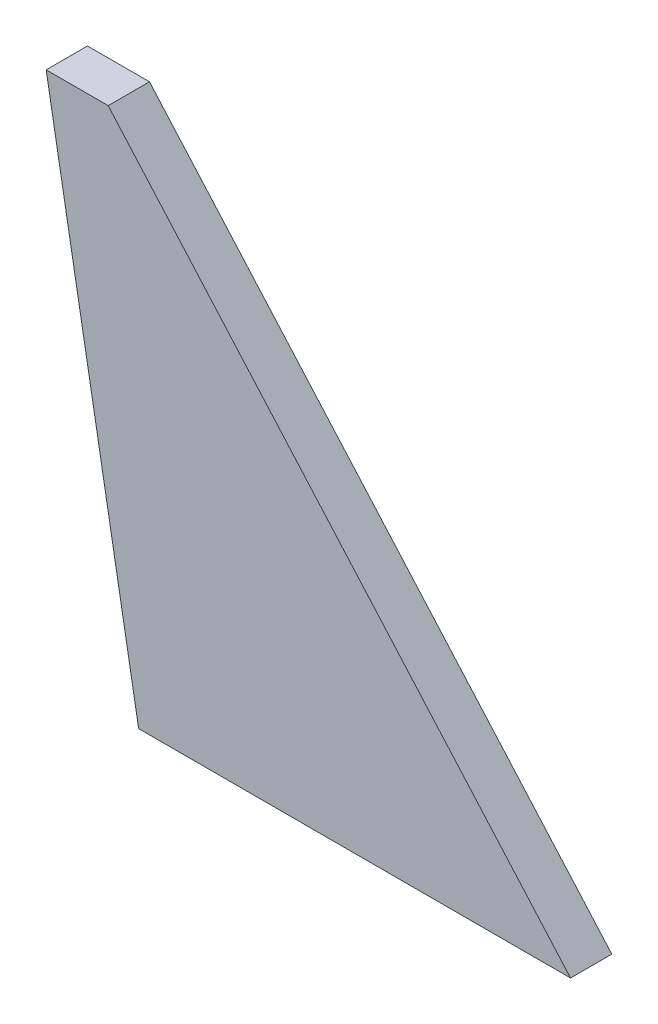
ISO-10303-21;
HEADER;
FILE_DESCRIPTION(('STEP AP214'),'2;1');
FILE_NAME('part.step','',(''),(''),'','','');
FILE_SCHEMA(('AUTOMOTIVE_DESIGN { 1 0 10303 214 1 1 1 1 }'));
ENDSEC;
DATA;
#1=APPLICATION_CONTEXT('core data for automotive mechanical design processes');
#2=APPLICATION_PROTOCOL_DEFINITION('international standard','automotive_design',2000,#1);
#3=PRODUCT_CONTEXT('',#1,'mechanical');
#4=PRODUCT('Part','Part','',(#3));
#5=PRODUCT_RELATED_PRODUCT_CATEGORY('part','',(#4));
#6=PRODUCT_DEFINITION_FORMATION('','',#4);
#7=PRODUCT_DEFINITION_CONTEXT('part definition',#1,'design');
#8=PRODUCT_DEFINITION('design','',#6,#7);
#9=PRODUCT_DEFINITION_SHAPE('','',#8);
#10=(LENGTH_UNIT() NAMED_UNIT(*) SI_UNIT(.MILLI.,.METRE.));
#11=(NAMED_UNIT(*) PLANE_ANGLE_UNIT() SI_UNIT($,.RADIAN.));
#12=(NAMED_UNIT(*) SI_UNIT($,.STERADIAN.) SOLID_ANGLE_UNIT());
#13=UNCERTAINTY_MEASURE_WITH_UNIT(LENGTH_MEASURE(1.E-05),#10,'distance_accuracy_value','');
#14=(GEOMETRIC_REPRESENTATION_CONTEXT(3) GLOBAL_UNCERTAINTY_ASSIGNED_CONTEXT((#13)) GLOBAL_UNIT_ASSIGNED_CONTEXT((#10,
#11,#12)) REPRESENTATION_CONTEXT('',''));
#15=CARTESIAN_POINT('',(0.,0.,0.));
#16=DIRECTION('',(0.,0.,1.));
#17=DIRECTION('',(1.,0.,0.));
#18=AXIS2_PLACEMENT_3D('',#15,#16,#17);
#19=CARTESIAN_POINT('',(0.,25.4,2.));
#20=DIRECTION('',(0.,-1.,0.));
#21=DIRECTION('',(0.,0.,-1.));
#22=AXIS2_PLACEMENT_3D('',#19,#20,#21);
#23=PLANE('',#22);
#24=DIRECTION('',(-1.,0.,0.));
#25=VECTOR('',#24,1.);
#26=CARTESIAN_POINT('',(0.,25.4,0.));
#27=LINE('',#26,#25);
#28=CARTESIAN_POINT('',(3.00354637406427,25.4,0.));
#29=VERTEX_POINT('',#28);
#30=CARTESIAN_POINT('',(0.,25.4,0.));
#31=VERTEX_POINT('',#30);
#32=EDGE_CURVE('E100',#29,#31,#27,.T.);
#33=ORIENTED_EDGE('',*,*,#32,.T.);
#34=DIRECTION('',(0.,0.,-1.));
#35=VECTOR('',#34,1.);
#36=CARTESIAN_POINT('',(0.,25.4,2.));
#37=LINE('',#36,#35);
#38=CARTESIAN_POINT('',(0.,25.4,2.));
#39=VERTEX_POINT('',#38);
#40=EDGE_CURVE('E11',#39,#31,#37,.T.);
#41=ORIENTED_EDGE('',*,*,#40,.F.);
#42=DIRECTION('',(-1.,0.,0.));
#43=VECTOR('',#42,1.);
#44=CARTESIAN_POINT('',(0.,25.4,2.));
#45=LINE('',#44,#43);
#46=CARTESIAN_POINT('',(3.00354637406427,25.4,2.));
#47=VERTEX_POINT('',#46);
#48=EDGE_CURVE('E88',#47,#39,#45,.T.);
#49=ORIENTED_EDGE('',*,*,#48,.F.);
#50=DIRECTION('',(0.,0.,-1.));
#51=VECTOR('',#50,1.);
#52=CARTESIAN_POINT('',(3.00354637406427,25.4,2.));
#53=LINE('',#52,#51);
#54=EDGE_CURVE('E96',#47,#29,#53,.T.);
#55=ORIENTED_EDGE('',*,*,#54,.T.);
#56=EDGE_LOOP('',(#33,#41,#49,#55));
#57=FACE_BOUND('',#56,.T.);
#58=ADVANCED_FACE('F37',(#57),#23,.F.);
#59=CARTESIAN_POINT('',(0.,25.4,2.));
#60=DIRECTION('',(0.984807753012209,0.173648177666927,0.));
#61=DIRECTION('',(-0.173648177666927,0.984807753012209,0.));
#62=AXIS2_PLACEMENT_3D('',#59,#60,#61);
#63=PLANE('',#62);
#64=DIRECTION('',(0.173648177666927,-0.984807753012209,0.));
#65=VECTOR('',#64,1.);
#66=CARTESIAN_POINT('',(0.,25.4,0.));
#67=LINE('',#66,#65);
#68=CARTESIAN_POINT('',(4.47870530999493,0.,0.));
#69=VERTEX_POINT('',#68);
#70=EDGE_CURVE('E92',#31,#69,#67,.T.);
#71=ORIENTED_EDGE('',*,*,#70,.T.);
#72=DIRECTION('',(0.,0.,-1.));
#73=VECTOR('',#72,1.);
#74=CARTESIAN_POINT('',(4.47870530999493,0.,2.));
#75=LINE('',#74,#73);
#76=CARTESIAN_POINT('',(4.47870530999493,0.,2.));
#77=VERTEX_POINT('',#76);
#78=EDGE_CURVE('E45',#77,#69,#75,.T.);
#79=ORIENTED_EDGE('',*,*,#78,.F.);
#80=DIRECTION('',(0.173648177666927,-0.984807753012209,0.));
#81=VECTOR('',#80,1.);
#82=CARTESIAN_POINT('',(0.,25.4,2.));
#83=LINE('',#82,#81);
#84=EDGE_CURVE('E83',#39,#77,#83,.T.);
#85=ORIENTED_EDGE('',*,*,#84,.F.);
#86=ORIENTED_EDGE('',*,*,#40,.T.);
#87=EDGE_LOOP('',(#71,#79,#85,#86));
#88=FACE_BOUND('',#87,.T.);
#89=ADVANCED_FACE('F91',(#88),#63,.F.);
#90=CARTESIAN_POINT('',(4.47870530999493,0.,2.));
#91=DIRECTION('',(0.,1.,0.));
#92=DIRECTION('',(-1.,0.,0.));
#93=AXIS2_PLACEMENT_3D('',#90,#91,#92);
#94=PLANE('',#93);
#95=DIRECTION('',(1.,0.,0.));
#96=VECTOR('',#95,1.);
#97=CARTESIAN_POINT('',(4.47870530999493,0.,0.));
#98=LINE('',#97,#96);
#99=CARTESIAN_POINT('',(25.4,0.,0.));
#100=VERTEX_POINT('',#99);
#101=EDGE_CURVE('E70',#69,#100,#98,.T.);
#102=ORIENTED_EDGE('',*,*,#101,.T.);
#103=DIRECTION('',(0.,0.,-1.));
#104=VECTOR('',#103,1.);
#105=CARTESIAN_POINT('',(25.4,0.,2.));
#106=LINE('',#105,#104);
#107=CARTESIAN_POINT('',(25.4,0.,2.));
#108=VERTEX_POINT('',#107);
#109=EDGE_CURVE('E93',#108,#100,#106,.T.);
#110=ORIENTED_EDGE('',*,*,#109,.F.);
#111=DIRECTION('',(1.,0.,0.));
#112=VECTOR('',#111,1.);
#113=CARTESIAN_POINT('',(4.47870530999493,0.,2.));
#114=LINE('',#113,#112);
#115=EDGE_CURVE('E86',#77,#108,#114,.T.);
#116=ORIENTED_EDGE('',*,*,#115,.F.);
#117=ORIENTED_EDGE('',*,*,#78,.T.);
#118=EDGE_LOOP('',(#102,#110,#116,#117));
#119=FACE_BOUND('',#118,.T.);
#120=ADVANCED_FACE('F94',(#119),#94,.F.);
#121=CARTESIAN_POINT('',(3.00354637406427,25.4,2.));
#122=DIRECTION('',(-0.750062121118534,-0.661367382370167,0.));
#123=DIRECTION('',(0.661367382370167,-0.750062121118534,0.));
#124=AXIS2_PLACEMENT_3D('',#121,#122,#123);
#125=PLANE('',#124);
#126=DIRECTION('',(-0.661367382370167,0.750062121118534,0.));
#127=VECTOR('',#126,1.);
#128=CARTESIAN_POINT('',(3.00354637406427,25.4,0.));
#129=LINE('',#128,#127);
#130=EDGE_CURVE('E76',#100,#29,#129,.T.);
#131=ORIENTED_EDGE('',*,*,#130,.T.);
#132=ORIENTED_EDGE('',*,*,#54,.F.);
#133=DIRECTION('',(-0.661367382370167,0.750062121118534,0.));
#134=VECTOR('',#133,1.);
#135=CARTESIAN_POINT('',(3.00354637406427,25.4,2.));
#136=LINE('',#135,#134);
#137=EDGE_CURVE('E53',#108,#47,#136,.T.);
#138=ORIENTED_EDGE('',*,*,#137,.F.);
#139=ORIENTED_EDGE('',*,*,#109,.T.);
#140=EDGE_LOOP('',(#131,#132,#138,#139));
#141=FACE_BOUND('',#140,.T.);
#142=ADVANCED_FACE('F107',(#141),#125,.F.);
#143=CARTESIAN_POINT('',(0.,0.,2.));
#144=DIRECTION('',(0.,0.,-1.));
#145=DIRECTION('',(-1.,0.,0.));
#146=AXIS2_PLACEMENT_3D('',#143,#144,#145);
#147=PLANE('',#146);
#148=ORIENTED_EDGE('',*,*,#48,.T.);
#149=ORIENTED_EDGE('',*,*,#84,.T.);
#150=ORIENTED_EDGE('',*,*,#115,.T.);
#151=ORIENTED_EDGE('',*,*,#137,.T.);
#152=EDGE_LOOP('',(#148,#149,#150,#151));
#153=FACE_BOUND('',#152,.T.);
#154=ADVANCED_FACE('F84',(#153),#147,.F.);
#155=CARTESIAN_POINT('',(0.,0.,0.));
#156=DIRECTION('',(0.,0.,-1.));
#157=DIRECTION('',(-1.,0.,0.));
#158=AXIS2_PLACEMENT_3D('',#155,#156,#157);
#159=PLANE('',#158);
#160=ORIENTED_EDGE('',*,*,#32,.F.);
#161=ORIENTED_EDGE('',*,*,#130,.F.);
#162=ORIENTED_EDGE('',*,*,#101,.F.);
#163=ORIENTED_EDGE('',*,*,#70,.F.);
#164=EDGE_LOOP('',(#160,#161,#162,#163));
#165=FACE_BOUND('',#164,.T.);
#166=ADVANCED_FACE('F110',(#165),#159,.T.);
#167=CLOSED_SHELL('',(#58,#89,#120,#142,#154,#166));
#168=MANIFOLD_SOLID_BREP('B2',#167);
#169=ADVANCED_BREP_SHAPE_REPRESENTATION('',(#18,#168),#14);
#170=SHAPE_DEFINITION_REPRESENTATION(#9,#169);
ENDSEC;
END-ISO-10303-21;
